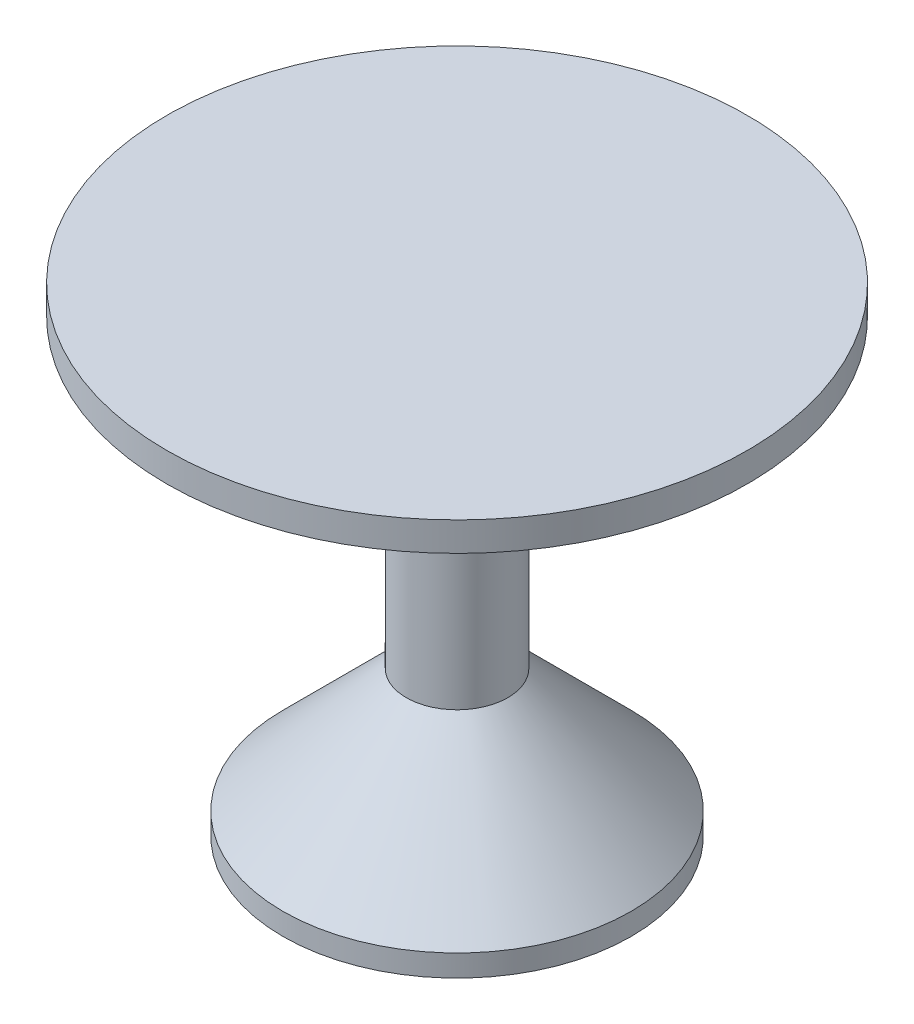
ISO-10303-21;
HEADER;
FILE_DESCRIPTION(('STEP AP214'),'2;1');
FILE_NAME('part.step','',(''),(''),'','','');
FILE_SCHEMA(('AUTOMOTIVE_DESIGN { 1 0 10303 214 1 1 1 1 }'));
ENDSEC;
DATA;
#1=APPLICATION_CONTEXT('core data for automotive mechanical design processes');
#2=APPLICATION_PROTOCOL_DEFINITION('international standard','automotive_design',2000,#1);
#3=PRODUCT_CONTEXT('',#1,'mechanical');
#4=PRODUCT('Part','Part','',(#3));
#5=PRODUCT_RELATED_PRODUCT_CATEGORY('part','',(#4));
#6=PRODUCT_DEFINITION_FORMATION('','',#4);
#7=PRODUCT_DEFINITION_CONTEXT('part definition',#1,'design');
#8=PRODUCT_DEFINITION('design','',#6,#7);
#9=PRODUCT_DEFINITION_SHAPE('','',#8);
#10=(LENGTH_UNIT() NAMED_UNIT(*) SI_UNIT(.MILLI.,.METRE.));
#11=(NAMED_UNIT(*) PLANE_ANGLE_UNIT() SI_UNIT($,.RADIAN.));
#12=(NAMED_UNIT(*) SI_UNIT($,.STERADIAN.) SOLID_ANGLE_UNIT());
#13=UNCERTAINTY_MEASURE_WITH_UNIT(LENGTH_MEASURE(1.E-05),#10,'distance_accuracy_value','');
#14=(GEOMETRIC_REPRESENTATION_CONTEXT(3) GLOBAL_UNCERTAINTY_ASSIGNED_CONTEXT((#13)) GLOBAL_UNIT_ASSIGNED_CONTEXT((#10,
#11,#12)) REPRESENTATION_CONTEXT('',''));
#15=CARTESIAN_POINT('',(0.,0.,0.));
#16=DIRECTION('',(0.,0.,1.));
#17=DIRECTION('',(1.,0.,0.));
#18=AXIS2_PLACEMENT_3D('',#15,#16,#17);
#19=CARTESIAN_POINT('',(0.,4.,0.));
#20=DIRECTION('',(0.,-1.,0.));
#21=DIRECTION('',(0.,0.,-1.));
#22=AXIS2_PLACEMENT_3D('',#19,#20,#21);
#23=CYLINDRICAL_SURFACE('',#22,24.5);
#24=CARTESIAN_POINT('',(0.,4.,0.));
#25=DIRECTION('',(0.,1.,0.));
#26=DIRECTION('',(0.,0.,1.));
#27=AXIS2_PLACEMENT_3D('',#24,#25,#26);
#28=CIRCLE('',#27,24.5);
#29=CARTESIAN_POINT('',(0.,4.,24.5));
#30=VERTEX_POINT('',#29);
#31=EDGE_CURVE('E77',#30,#30,#28,.T.);
#32=ORIENTED_EDGE('',*,*,#31,.F.);
#33=EDGE_LOOP('',(#32));
#34=FACE_BOUND('',#33,.T.);
#35=CARTESIAN_POINT('',(0.,0.,0.));
#36=DIRECTION('',(0.,1.,0.));
#37=DIRECTION('',(0.,0.,1.));
#38=AXIS2_PLACEMENT_3D('',#35,#36,#37);
#39=CIRCLE('',#38,24.5);
#40=CARTESIAN_POINT('',(0.,0.,24.5));
#41=VERTEX_POINT('',#40);
#42=EDGE_CURVE('E78',#41,#41,#39,.T.);
#43=ORIENTED_EDGE('',*,*,#42,.T.);
#44=EDGE_LOOP('',(#43));
#45=FACE_BOUND('',#44,.T.);
#46=ADVANCED_FACE('F47',(#34,#45),#23,.T.);
#47=CARTESIAN_POINT('',(0.,0.,0.));
#48=DIRECTION('',(0.,1.,0.));
#49=DIRECTION('',(0.,0.,1.));
#50=AXIS2_PLACEMENT_3D('',#47,#48,#49);
#51=PLANE('',#50);
#52=ORIENTED_EDGE('',*,*,#42,.F.);
#53=EDGE_LOOP('',(#52));
#54=FACE_BOUND('',#53,.T.);
#55=ADVANCED_FACE('F116',(#54),#51,.F.);
#56=CARTESIAN_POINT('',(0.,9.,0.));
#57=DIRECTION('',(0.,-1.,0.));
#58=DIRECTION('',(0.,0.,-1.));
#59=AXIS2_PLACEMENT_3D('',#56,#57,#58);
#60=CYLINDRICAL_SURFACE('',#59,60.);
#61=CARTESIAN_POINT('',(0.,11.5000000000004,0.));
#62=DIRECTION('',(0.,-1.,0.));
#63=DIRECTION('',(0.,0.,-1.));
#64=AXIS2_PLACEMENT_3D('',#61,#62,#63);
#65=CIRCLE('',#64,60.);
#66=CARTESIAN_POINT('',(0.,11.5000000000004,-60.));
#67=VERTEX_POINT('',#66);
#68=EDGE_CURVE('E63',#67,#67,#65,.T.);
#69=ORIENTED_EDGE('',*,*,#68,.T.);
#70=EDGE_LOOP('',(#69));
#71=FACE_BOUND('',#70,.T.);
#72=CARTESIAN_POINT('',(0.,4.,0.));
#73=DIRECTION('',(0.,1.,0.));
#74=DIRECTION('',(0.,0.,1.));
#75=AXIS2_PLACEMENT_3D('',#72,#73,#74);
#76=CIRCLE('',#75,60.);
#77=CARTESIAN_POINT('',(0.,4.,60.));
#78=VERTEX_POINT('',#77);
#79=EDGE_CURVE('E81',#78,#78,#76,.T.);
#80=ORIENTED_EDGE('',*,*,#79,.T.);
#81=EDGE_LOOP('',(#80));
#82=FACE_BOUND('',#81,.T.);
#83=ADVANCED_FACE('F122',(#71,#82),#60,.T.);
#84=CARTESIAN_POINT('',(0.,4.,0.));
#85=DIRECTION('',(0.,1.,0.));
#86=DIRECTION('',(0.,0.,1.));
#87=AXIS2_PLACEMENT_3D('',#84,#85,#86);
#88=PLANE('',#87);
#89=ORIENTED_EDGE('',*,*,#31,.T.);
#90=EDGE_LOOP('',(#89));
#91=FACE_BOUND('',#90,.T.);
#92=ORIENTED_EDGE('',*,*,#79,.F.);
#93=EDGE_LOOP('',(#92));
#94=FACE_BOUND('',#93,.T.);
#95=ADVANCED_FACE('F135',(#91,#94),#88,.F.);
#96=CARTESIAN_POINT('',(0.,159.,0.));
#97=DIRECTION('',(0.,-1.,0.));
#98=DIRECTION('',(0.,0.,-1.));
#99=AXIS2_PLACEMENT_3D('',#96,#97,#98);
#100=CYLINDRICAL_SURFACE('',#99,17.5);
#101=CARTESIAN_POINT('',(0.,129.,0.));
#102=DIRECTION('',(0.,1.,0.));
#103=DIRECTION('',(0.,0.,1.));
#104=AXIS2_PLACEMENT_3D('',#101,#102,#103);
#105=CIRCLE('',#104,17.5);
#106=CARTESIAN_POINT('',(0.,129.,17.5));
#107=VERTEX_POINT('',#106);
#108=EDGE_CURVE('E10',#107,#107,#105,.F.);
#109=ORIENTED_EDGE('',*,*,#108,.T.);
#110=EDGE_LOOP('',(#109));
#111=FACE_BOUND('',#110,.T.);
#112=CARTESIAN_POINT('',(0.,54.0000000000008,0.));
#113=DIRECTION('',(0.,1.,0.));
#114=DIRECTION('',(0.,0.,1.));
#115=AXIS2_PLACEMENT_3D('',#112,#113,#114);
#116=CIRCLE('',#115,17.5);
#117=CARTESIAN_POINT('',(0.,54.0000000000008,-17.5));
#118=VERTEX_POINT('',#117);
#119=EDGE_CURVE('E71',#118,#118,#116,.T.);
#120=ORIENTED_EDGE('',*,*,#119,.T.);
#121=EDGE_LOOP('',(#120));
#122=FACE_BOUND('',#121,.T.);
#123=ADVANCED_FACE('F101',(#111,#122),#100,.T.);
#124=CARTESIAN_POINT('',(0.,169.,0.));
#125=DIRECTION('',(0.,-1.,0.));
#126=DIRECTION('',(0.,0.,-1.));
#127=AXIS2_PLACEMENT_3D('',#124,#125,#126);
#128=CYLINDRICAL_SURFACE('',#127,100.);
#129=CARTESIAN_POINT('',(0.,169.,0.));
#130=DIRECTION('',(0.,1.,0.));
#131=DIRECTION('',(0.,0.,1.));
#132=AXIS2_PLACEMENT_3D('',#129,#130,#131);
#133=CIRCLE('',#132,100.);
#134=CARTESIAN_POINT('',(0.,169.,100.));
#135=VERTEX_POINT('',#134);
#136=EDGE_CURVE('E87',#135,#135,#133,.T.);
#137=ORIENTED_EDGE('',*,*,#136,.F.);
#138=EDGE_LOOP('',(#137));
#139=FACE_BOUND('',#138,.T.);
#140=CARTESIAN_POINT('',(0.,159.,0.));
#141=DIRECTION('',(0.,1.,0.));
#142=DIRECTION('',(0.,0.,1.));
#143=AXIS2_PLACEMENT_3D('',#140,#141,#142);
#144=CIRCLE('',#143,100.);
#145=CARTESIAN_POINT('',(0.,159.,100.));
#146=VERTEX_POINT('',#145);
#147=EDGE_CURVE('E88',#146,#146,#144,.T.);
#148=ORIENTED_EDGE('',*,*,#147,.T.);
#149=EDGE_LOOP('',(#148));
#150=FACE_BOUND('',#149,.T.);
#151=ADVANCED_FACE('F98',(#139,#150),#128,.T.);
#152=CARTESIAN_POINT('',(0.,169.,0.));
#153=DIRECTION('',(0.,1.,0.));
#154=DIRECTION('',(0.,0.,1.));
#155=AXIS2_PLACEMENT_3D('',#152,#153,#154);
#156=PLANE('',#155);
#157=ORIENTED_EDGE('',*,*,#136,.T.);
#158=EDGE_LOOP('',(#157));
#159=FACE_BOUND('',#158,.T.);
#160=ADVANCED_FACE('F96',(#159),#156,.T.);
#161=CARTESIAN_POINT('',(0.,159.,0.));
#162=DIRECTION('',(0.,1.,0.));
#163=DIRECTION('',(0.,0.,1.));
#164=AXIS2_PLACEMENT_3D('',#161,#162,#163);
#165=PLANE('',#164);
#166=CARTESIAN_POINT('',(0.,159.,0.));
#167=DIRECTION('',(0.,1.,0.));
#168=DIRECTION('',(0.,0.,1.));
#169=AXIS2_PLACEMENT_3D('',#166,#167,#168);
#170=CIRCLE('',#169,69.4615242270669);
#171=CARTESIAN_POINT('',(0.,159.,69.4615242270669));
#172=VERTEX_POINT('',#171);
#173=EDGE_CURVE('E56',#172,#172,#170,.T.);
#174=ORIENTED_EDGE('',*,*,#173,.T.);
#175=EDGE_LOOP('',(#174));
#176=FACE_BOUND('',#175,.T.);
#177=ORIENTED_EDGE('',*,*,#147,.F.);
#178=EDGE_LOOP('',(#177));
#179=FACE_BOUND('',#178,.T.);
#180=ADVANCED_FACE('F105',(#176,#179),#165,.F.);
#181=CARTESIAN_POINT('',(0.,54.0000000000008,0.));
#182=DIRECTION('',(0.,-1.,0.));
#183=DIRECTION('',(0.,0.,-1.));
#184=AXIS2_PLACEMENT_3D('',#181,#182,#183);
#185=CONICAL_SURFACE('',#184,17.5,0.785398163397443);
#186=CARTESIAN_POINT('',(0.,11.5000000000004,-60.));
#187=CARTESIAN_POINT('',(0.,11.9427083333337,-59.5572916666667));
#188=CARTESIAN_POINT('',(0.,12.385416666667,-59.1145833333333));
#189=CARTESIAN_POINT('',(0.,13.2708333333337,-58.2291666666667));
#190=CARTESIAN_POINT('',(0.,13.713541666667,-57.7864583333333));
#191=CARTESIAN_POINT('',(0.,14.5989583333337,-56.9010416666667));
#192=CARTESIAN_POINT('',(0.,15.0416666666671,-56.4583333333333));
#193=CARTESIAN_POINT('',(0.,15.9270833333337,-55.5729166666667));
#194=CARTESIAN_POINT('',(0.,16.3697916666671,-55.1302083333333));
#195=CARTESIAN_POINT('',(0.,17.2552083333337,-54.2447916666667));
#196=CARTESIAN_POINT('',(0.,17.6979166666671,-53.8020833333333));
#197=CARTESIAN_POINT('',(0.,18.5833333333338,-52.9166666666667));
#198=CARTESIAN_POINT('',(0.,19.0260416666671,-52.4739583333333));
#199=CARTESIAN_POINT('',(0.,19.9114583333338,-51.5885416666667));
#200=CARTESIAN_POINT('',(0.,20.3541666666671,-51.1458333333333));
#201=CARTESIAN_POINT('',(0.,21.2395833333338,-50.2604166666667));
#202=CARTESIAN_POINT('',(0.,21.6822916666671,-49.8177083333333));
#203=CARTESIAN_POINT('',(0.,22.5677083333338,-48.9322916666667));
#204=CARTESIAN_POINT('',(0.,23.0104166666671,-48.4895833333333));
#205=CARTESIAN_POINT('',(0.,23.8958333333338,-47.6041666666667));
#206=CARTESIAN_POINT('',(0.,24.3385416666672,-47.1614583333333));
#207=CARTESIAN_POINT('',(0.,25.2239583333338,-46.2760416666667));
#208=CARTESIAN_POINT('',(0.,25.6666666666672,-45.8333333333333));
#209=CARTESIAN_POINT('',(0.,26.5520833333338,-44.9479166666667));
#210=CARTESIAN_POINT('',(0.,26.9947916666672,-44.5052083333333));
#211=CARTESIAN_POINT('',(0.,27.8802083333339,-43.6197916666667));
#212=CARTESIAN_POINT('',(0.,28.3229166666672,-43.1770833333333));
#213=CARTESIAN_POINT('',(0.,29.2083333333339,-42.2916666666667));
#214=CARTESIAN_POINT('',(0.,29.6510416666672,-41.8489583333333));
#215=CARTESIAN_POINT('',(0.,30.5364583333339,-40.9635416666667));
#216=CARTESIAN_POINT('',(0.,30.9791666666672,-40.5208333333333));
#217=CARTESIAN_POINT('',(0.,31.8645833333339,-39.6354166666667));
#218=CARTESIAN_POINT('',(0.,32.3072916666672,-39.1927083333333));
#219=CARTESIAN_POINT('',(0.,33.1927083333339,-38.3072916666667));
#220=CARTESIAN_POINT('',(0.,33.6354166666672,-37.8645833333333));
#221=CARTESIAN_POINT('',(0.,34.5208333333339,-36.9791666666667));
#222=CARTESIAN_POINT('',(0.,34.9635416666673,-36.5364583333333));
#223=CARTESIAN_POINT('',(0.,35.8489583333339,-35.6510416666667));
#224=CARTESIAN_POINT('',(0.,36.2916666666673,-35.2083333333333));
#225=CARTESIAN_POINT('',(0.,37.177083333334,-34.3229166666667));
#226=CARTESIAN_POINT('',(0.,37.6197916666673,-33.8802083333333));
#227=CARTESIAN_POINT('',(0.,38.505208333334,-32.9947916666667));
#228=CARTESIAN_POINT('',(0.,38.9479166666673,-32.5520833333333));
#229=CARTESIAN_POINT('',(0.,39.833333333334,-31.6666666666667));
#230=CARTESIAN_POINT('',(0.,40.2760416666673,-31.2239583333333));
#231=CARTESIAN_POINT('',(0.,41.161458333334,-30.3385416666667));
#232=CARTESIAN_POINT('',(0.,41.6041666666673,-29.8958333333333));
#233=CARTESIAN_POINT('',(0.,42.489583333334,-29.0104166666667));
#234=CARTESIAN_POINT('',(0.,42.9322916666673,-28.5677083333333));
#235=CARTESIAN_POINT('',(0.,43.817708333334,-27.6822916666667));
#236=CARTESIAN_POINT('',(0.,44.2604166666674,-27.2395833333333));
#237=CARTESIAN_POINT('',(0.,45.145833333334,-26.3541666666667));
#238=CARTESIAN_POINT('',(0.,45.5885416666674,-25.9114583333333));
#239=CARTESIAN_POINT('',(0.,46.4739583333341,-25.0260416666667));
#240=CARTESIAN_POINT('',(0.,46.9166666666674,-24.5833333333333));
#241=CARTESIAN_POINT('',(0.,47.8020833333341,-23.6979166666667));
#242=CARTESIAN_POINT('',(0.,48.2447916666674,-23.2552083333333));
#243=CARTESIAN_POINT('',(0.,49.1302083333341,-22.3697916666667));
#244=CARTESIAN_POINT('',(0.,49.5729166666674,-21.9270833333333));
#245=CARTESIAN_POINT('',(0.,50.4583333333341,-21.0416666666667));
#246=CARTESIAN_POINT('',(0.,50.9010416666674,-20.5989583333333));
#247=CARTESIAN_POINT('',(0.,51.7864583333341,-19.7135416666667));
#248=CARTESIAN_POINT('',(0.,52.2291666666674,-19.2708333333333));
#249=CARTESIAN_POINT('',(0.,53.1145833333341,-18.3854166666667));
#250=CARTESIAN_POINT('',(0.,53.5572916666675,-17.9427083333333));
#251=CARTESIAN_POINT('',(0.,54.0000000000008,-17.5));
#252=B_SPLINE_CURVE_WITH_KNOTS('',3,(#186,#187,#188,#189,#190,#191,#192,#193,#194,#195,#196,
#197,#198,#199,#200,#201,#202,#203,#204,#205,#206,#207,#208,#209,#210,#211,#212,#213,#214,#215,
#216,#217,#218,#219,#220,#221,#222,#223,#224,#225,#226,#227,#228,#229,#230,#231,#232,#233,#234,
#235,#236,#237,#238,#239,#240,#241,#242,#243,#244,#245,#246,#247,#248,#249,#250,#251),
.UNSPECIFIED.,.F.,.F.,(4,2,2,2,2,2,2,2,2,2,2,2,2,2,2,2,2,2,2,2,2,2,2,2,2,2,2,2,2,2,2,2,4),(0.,
1.87825238752678,3.75650477505355,5.63475716258033,7.5130095501071,9.39126193763388,
11.2695143251607,13.1477667126874,15.0260191002142,16.904271487741,18.7825238752678,
20.6607762627945,22.5390286503213,24.4172810378481,26.2955334253749,28.1737858129016,
30.0520382004284,31.9302905879552,33.808542975482,35.6867953630088,37.5650477505355,
39.4433001380623,41.3215525255891,43.1998049131159,45.0780573006426,46.9563096881694,
48.8345620756962,50.712814463223,52.5910668507498,54.4693192382765,56.3475716258033,
58.2258240133301,60.1040764008569),.UNSPECIFIED.);
#253=EDGE_CURVE('BSEAM107',#67,#118,#252,.T.);
#254=ORIENTED_EDGE('',*,*,#68,.F.);
#255=ORIENTED_EDGE('',*,*,#119,.F.);
#256=ORIENTED_EDGE('',*,*,#253,.T.);
#257=ORIENTED_EDGE('',*,*,#253,.F.);
#258=EDGE_LOOP('',(#254,#256,#255,#257));
#259=FACE_BOUND('',#258,.T.);
#260=ADVANCED_FACE('F107',(#259),#185,.T.);
#261=CARTESIAN_POINT('',(0.,159.,0.));
#262=DIRECTION('',(0.,1.,0.));
#263=DIRECTION('',(0.,0.,1.));
#264=AXIS2_PLACEMENT_3D('',#261,#262,#263);
#265=CONICAL_SURFACE('',#264,69.4615242270669,1.0471975511966);
#266=CARTESIAN_POINT('',(0.,129.,17.5));
#267=CARTESIAN_POINT('',(0.,129.3125,18.0412658773653));
#268=CARTESIAN_POINT('',(0.,129.625,18.5825317547305));
#269=CARTESIAN_POINT('',(0.,130.25,19.6650635094611));
#270=CARTESIAN_POINT('',(0.,130.5625,20.2063293868264));
#271=CARTESIAN_POINT('',(0.,131.1875,21.2888611415569));
#272=CARTESIAN_POINT('',(0.,131.5,21.8301270189222));
#273=CARTESIAN_POINT('',(0.,132.125,22.9126587736528));
#274=CARTESIAN_POINT('',(0.,132.4375,23.4539246510181));
#275=CARTESIAN_POINT('',(0.,133.0625,24.5364564057486));
#276=CARTESIAN_POINT('',(0.,133.375,25.0777222831139));
#277=CARTESIAN_POINT('',(0.,134.,26.1602540378445));
#278=CARTESIAN_POINT('',(0.,134.3125,26.7015199152097));
#279=CARTESIAN_POINT('',(0.,134.9375,27.7840516699403));
#280=CARTESIAN_POINT('',(0.,135.25,28.3253175473056));
#281=CARTESIAN_POINT('',(0.,135.875,29.4078493020361));
#282=CARTESIAN_POINT('',(0.,136.1875,29.9491151794014));
#283=CARTESIAN_POINT('',(0.,136.8125,31.031646934132));
#284=CARTESIAN_POINT('',(0.,137.125,31.5729128114973));
#285=CARTESIAN_POINT('',(0.,137.75,32.6554445662278));
#286=CARTESIAN_POINT('',(0.,138.0625,33.1967104435931));
#287=CARTESIAN_POINT('',(0.,138.6875,34.2792421983237));
#288=CARTESIAN_POINT('',(0.,139.,34.8205080756889));
#289=CARTESIAN_POINT('',(0.,139.625,35.9030398304195));
#290=CARTESIAN_POINT('',(0.,139.9375,36.4443057077848));
#291=CARTESIAN_POINT('',(0.,140.5625,37.5268374625154));
#292=CARTESIAN_POINT('',(0.,140.875,38.0681033398806));
#293=CARTESIAN_POINT('',(0.,141.5,39.1506350946112));
#294=CARTESIAN_POINT('',(0.,141.8125,39.6919009719765));
#295=CARTESIAN_POINT('',(0.,142.4375,40.774432726707));
#296=CARTESIAN_POINT('',(0.,142.75,41.3156986040723));
#297=CARTESIAN_POINT('',(0.,143.375,42.3982303588029));
#298=CARTESIAN_POINT('',(0.,143.6875,42.9394962361682));
#299=CARTESIAN_POINT('',(0.,144.3125,44.0220279908987));
#300=CARTESIAN_POINT('',(0.,144.625,44.563293868264));
#301=CARTESIAN_POINT('',(0.,145.25,45.6458256229946));
#302=CARTESIAN_POINT('',(0.,145.5625,46.1870915003598));
#303=CARTESIAN_POINT('',(0.,146.1875,47.2696232550904));
#304=CARTESIAN_POINT('',(0.,146.5,47.8108891324557));
#305=CARTESIAN_POINT('',(0.,147.125,48.8934208871862));
#306=CARTESIAN_POINT('',(0.,147.4375,49.4346867645515));
#307=CARTESIAN_POINT('',(0.,148.0625,50.5172185192821));
#308=CARTESIAN_POINT('',(0.,148.375,51.0584843966474));
#309=CARTESIAN_POINT('',(0.,149.,52.1410161513779));
#310=CARTESIAN_POINT('',(0.,149.3125,52.6822820287432));
#311=CARTESIAN_POINT('',(0.,149.9375,53.7648137834738));
#312=CARTESIAN_POINT('',(0.,150.25,54.306079660839));
#313=CARTESIAN_POINT('',(0.,150.875,55.3886114155696));
#314=CARTESIAN_POINT('',(0.,151.1875,55.9298772929349));
#315=CARTESIAN_POINT('',(0.,151.8125,57.0124090476655));
#316=CARTESIAN_POINT('',(0.,152.125,57.5536749250307));
#317=CARTESIAN_POINT('',(0.,152.75,58.6362066797613));
#318=CARTESIAN_POINT('',(0.,153.0625,59.1774725571266));
#319=CARTESIAN_POINT('',(0.,153.6875,60.2600043118571));
#320=CARTESIAN_POINT('',(0.,154.,60.8012701892224));
#321=CARTESIAN_POINT('',(0.,154.625,61.883801943953));
#322=CARTESIAN_POINT('',(0.,154.9375,62.4250678213182));
#323=CARTESIAN_POINT('',(0.,155.5625,63.5075995760488));
#324=CARTESIAN_POINT('',(0.,155.875,64.0488654534141));
#325=CARTESIAN_POINT('',(0.,156.5,65.1313972081447));
#326=CARTESIAN_POINT('',(0.,156.8125,65.6726630855099));
#327=CARTESIAN_POINT('',(0.,157.4375,66.7551948402405));
#328=CARTESIAN_POINT('',(0.,157.75,67.2964607176058));
#329=CARTESIAN_POINT('',(0.,158.375,68.3789924723363));
#330=CARTESIAN_POINT('',(0.,158.6875,68.9202583497016));
#331=CARTESIAN_POINT('',(0.,159.,69.4615242270669));
#332=B_SPLINE_CURVE_WITH_KNOTS('',3,(#266,#267,#268,#269,#270,#271,#272,#273,#274,#275,#276,
#277,#278,#279,#280,#281,#282,#283,#284,#285,#286,#287,#288,#289,#290,#291,#292,#293,#294,#295,
#296,#297,#298,#299,#300,#301,#302,#303,#304,#305,#306,#307,#308,#309,#310,#311,#312,#313,#314,
#315,#316,#317,#318,#319,#320,#321,#322,#323,#324,#325,#326,#327,#328,#329,#330,#331),
.UNSPECIFIED.,.F.,.F.,(4,2,2,2,2,2,2,2,2,2,2,2,2,2,2,2,2,2,2,2,2,2,2,2,2,2,2,2,2,2,2,2,4),(0.,
1.87500000000001,3.75000000000003,5.62500000000005,7.50000000000006,9.37500000000007,
11.2500000000001,13.1250000000001,15.0000000000001,16.8750000000001,18.7500000000001,
20.6250000000002,22.5000000000002,24.3750000000002,26.2500000000002,28.1250000000002,
30.0000000000002,31.8750000000003,33.7500000000003,35.6250000000003,37.5000000000003,
39.3750000000003,41.2500000000003,43.1250000000003,45.0000000000004,46.8750000000004,
48.7500000000004,50.6250000000004,52.5000000000004,54.3750000000004,56.2500000000004,
58.1250000000005,60.0000000000005),.UNSPECIFIED.);
#333=EDGE_CURVE('BSEAM50',#107,#172,#332,.T.);
#334=ORIENTED_EDGE('',*,*,#108,.F.);
#335=ORIENTED_EDGE('',*,*,#173,.F.);
#336=ORIENTED_EDGE('',*,*,#333,.T.);
#337=ORIENTED_EDGE('',*,*,#333,.F.);
#338=EDGE_LOOP('',(#334,#336,#335,#337));
#339=FACE_BOUND('',#338,.T.);
#340=ADVANCED_FACE('F50',(#339),#265,.T.);
#341=CLOSED_SHELL('',(#46,#55,#83,#95,#123,#151,#160,#180,#260,#340));
#342=MANIFOLD_SOLID_BREP('B2',#341);
#343=ADVANCED_BREP_SHAPE_REPRESENTATION('',(#18,#342),#14);
#344=SHAPE_DEFINITION_REPRESENTATION(#9,#343);
ENDSEC;
END-ISO-10303-21;
